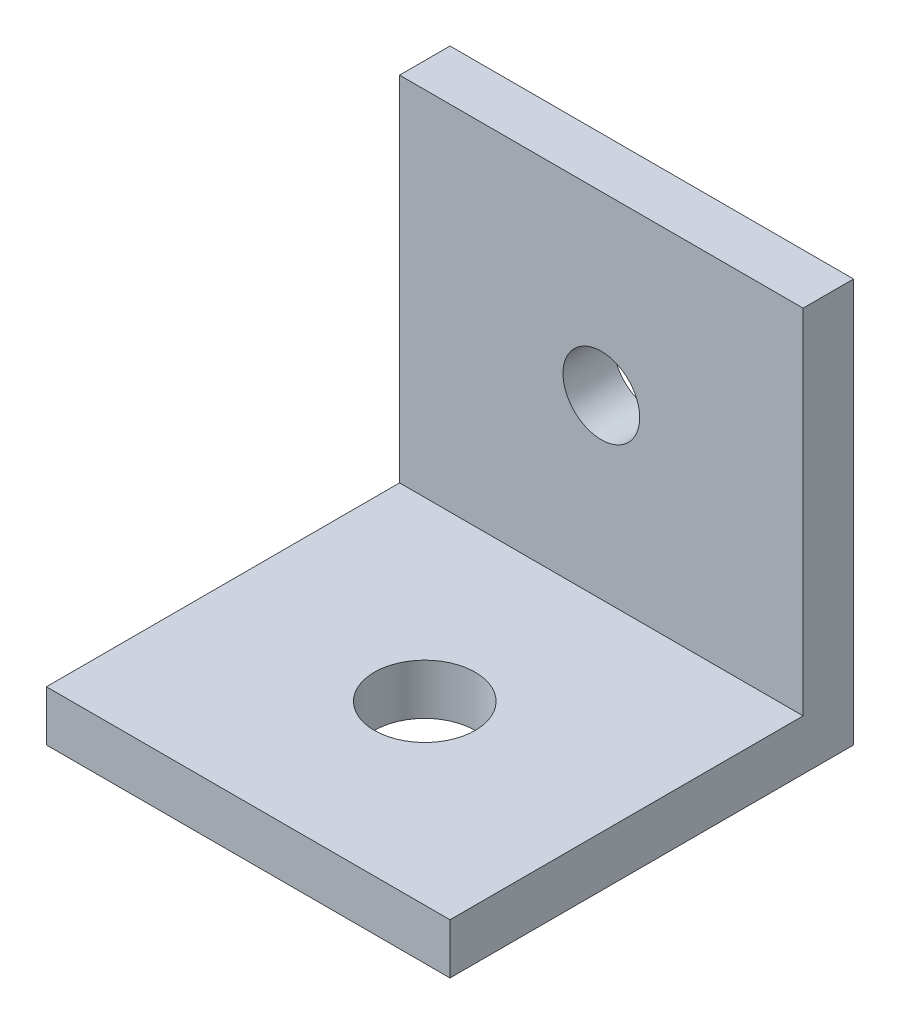
ISO-10303-21;
HEADER;
FILE_DESCRIPTION(('STEP AP214'),'2;1');
FILE_NAME('part.step','',(''),(''),'','','');
FILE_SCHEMA(('AUTOMOTIVE_DESIGN { 1 0 10303 214 1 1 1 1 }'));
ENDSEC;
DATA;
#1=APPLICATION_CONTEXT('core data for automotive mechanical design processes');
#2=APPLICATION_PROTOCOL_DEFINITION('international standard','automotive_design',2000,#1);
#3=PRODUCT_CONTEXT('',#1,'mechanical');
#4=PRODUCT('Part','Part','',(#3));
#5=PRODUCT_RELATED_PRODUCT_CATEGORY('part','',(#4));
#6=PRODUCT_DEFINITION_FORMATION('','',#4);
#7=PRODUCT_DEFINITION_CONTEXT('part definition',#1,'design');
#8=PRODUCT_DEFINITION('design','',#6,#7);
#9=PRODUCT_DEFINITION_SHAPE('','',#8);
#10=(LENGTH_UNIT() NAMED_UNIT(*) SI_UNIT(.MILLI.,.METRE.));
#11=(NAMED_UNIT(*) PLANE_ANGLE_UNIT() SI_UNIT($,.RADIAN.));
#12=(NAMED_UNIT(*) SI_UNIT($,.STERADIAN.) SOLID_ANGLE_UNIT());
#13=UNCERTAINTY_MEASURE_WITH_UNIT(LENGTH_MEASURE(1.E-05),#10,'distance_accuracy_value','');
#14=(GEOMETRIC_REPRESENTATION_CONTEXT(3) GLOBAL_UNCERTAINTY_ASSIGNED_CONTEXT((#13)) GLOBAL_UNIT_ASSIGNED_CONTEXT((#10,
#11,#12)) REPRESENTATION_CONTEXT('',''));
#15=CARTESIAN_POINT('',(0.,0.,0.));
#16=DIRECTION('',(0.,0.,1.));
#17=DIRECTION('',(1.,0.,0.));
#18=AXIS2_PLACEMENT_3D('',#15,#16,#17);
#19=CARTESIAN_POINT('',(0.,3.175,0.));
#20=DIRECTION('',(0.,-1.,0.));
#21=DIRECTION('',(0.,0.,-1.));
#22=AXIS2_PLACEMENT_3D('',#19,#20,#21);
#23=PLANE('',#22);
#24=CARTESIAN_POINT('',(0.,3.175,1.5875));
#25=DIRECTION('',(0.,1.,0.));
#26=DIRECTION('',(0.,0.,1.));
#27=AXIS2_PLACEMENT_3D('',#24,#25,#26);
#28=CIRCLE('',#27,3.175);
#29=CARTESIAN_POINT('',(0.,3.175,4.7625));
#30=VERTEX_POINT('',#29);
#31=EDGE_CURVE('E156',#30,#30,#28,.T.);
#32=ORIENTED_EDGE('',*,*,#31,.F.);
#33=EDGE_LOOP('',(#32));
#34=FACE_BOUND('',#33,.T.);
#35=DIRECTION('',(1.,0.,0.));
#36=VECTOR('',#35,1.);
#37=CARTESIAN_POINT('',(-12.7,3.175,-9.525));
#38=LINE('',#37,#36);
#39=CARTESIAN_POINT('',(-12.7,3.175,-9.525));
#40=VERTEX_POINT('',#39);
#41=CARTESIAN_POINT('',(12.7,3.175,-9.525));
#42=VERTEX_POINT('',#41);
#43=EDGE_CURVE('E54',#40,#42,#38,.T.);
#44=ORIENTED_EDGE('',*,*,#43,.F.);
#45=DIRECTION('',(0.,0.,1.));
#46=VECTOR('',#45,1.);
#47=CARTESIAN_POINT('',(-12.7,3.175,12.7));
#48=LINE('',#47,#46);
#49=CARTESIAN_POINT('',(-12.7,3.175,12.7));
#50=VERTEX_POINT('',#49);
#51=EDGE_CURVE('E140',#40,#50,#48,.T.);
#52=ORIENTED_EDGE('',*,*,#51,.T.);
#53=DIRECTION('',(1.,0.,0.));
#54=VECTOR('',#53,1.);
#55=CARTESIAN_POINT('',(-12.7,3.175,12.7));
#56=LINE('',#55,#54);
#57=CARTESIAN_POINT('',(12.7,3.175,12.7));
#58=VERTEX_POINT('',#57);
#59=EDGE_CURVE('E60',#50,#58,#56,.T.);
#60=ORIENTED_EDGE('',*,*,#59,.T.);
#61=DIRECTION('',(0.,0.,-1.));
#62=VECTOR('',#61,1.);
#63=CARTESIAN_POINT('',(12.7,3.175,12.7));
#64=LINE('',#63,#62);
#65=EDGE_CURVE('E89',#58,#42,#64,.T.);
#66=ORIENTED_EDGE('',*,*,#65,.T.);
#67=EDGE_LOOP('',(#44,#52,#60,#66));
#68=FACE_BOUND('',#67,.T.);
#69=ADVANCED_FACE('F39',(#34,#68),#23,.F.);
#70=CARTESIAN_POINT('',(12.7,3.175,12.7));
#71=DIRECTION('',(-1.,0.,0.));
#72=DIRECTION('',(0.,0.,1.));
#73=AXIS2_PLACEMENT_3D('',#70,#71,#72);
#74=PLANE('',#73);
#75=DIRECTION('',(0.,0.,-1.));
#76=VECTOR('',#75,1.);
#77=CARTESIAN_POINT('',(12.7,0.,12.7));
#78=LINE('',#77,#76);
#79=CARTESIAN_POINT('',(12.7,0.,12.7));
#80=VERTEX_POINT('',#79);
#81=CARTESIAN_POINT('',(12.7,0.,-12.7));
#82=VERTEX_POINT('',#81);
#83=EDGE_CURVE('E95',#80,#82,#78,.T.);
#84=ORIENTED_EDGE('',*,*,#83,.T.);
#85=DIRECTION('',(0.,-1.,0.));
#86=VECTOR('',#85,1.);
#87=CARTESIAN_POINT('',(12.7,3.175,-12.7));
#88=LINE('',#87,#86);
#89=CARTESIAN_POINT('',(12.7,25.4,-12.7));
#90=VERTEX_POINT('',#89);
#91=EDGE_CURVE('E11',#90,#82,#88,.T.);
#92=ORIENTED_EDGE('',*,*,#91,.F.);
#93=DIRECTION('',(0.,0.,-1.));
#94=VECTOR('',#93,1.);
#95=CARTESIAN_POINT('',(12.7,25.4,-12.7));
#96=LINE('',#95,#94);
#97=CARTESIAN_POINT('',(12.7,25.4,-9.525));
#98=VERTEX_POINT('',#97);
#99=EDGE_CURVE('E131',#98,#90,#96,.T.);
#100=ORIENTED_EDGE('',*,*,#99,.F.);
#101=DIRECTION('',(0.,-1.,0.));
#102=VECTOR('',#101,1.);
#103=CARTESIAN_POINT('',(12.7,25.4,-9.525));
#104=LINE('',#103,#102);
#105=EDGE_CURVE('E104',#98,#42,#104,.T.);
#106=ORIENTED_EDGE('',*,*,#105,.T.);
#107=ORIENTED_EDGE('',*,*,#65,.F.);
#108=DIRECTION('',(0.,-1.,0.));
#109=VECTOR('',#108,1.);
#110=CARTESIAN_POINT('',(12.7,3.175,12.7));
#111=LINE('',#110,#109);
#112=EDGE_CURVE('E82',#58,#80,#111,.T.);
#113=ORIENTED_EDGE('',*,*,#112,.T.);
#114=EDGE_LOOP('',(#84,#92,#100,#106,#107,#113));
#115=FACE_BOUND('',#114,.T.);
#116=ADVANCED_FACE('F41',(#115),#74,.F.);
#117=CARTESIAN_POINT('',(-12.7,3.175,-12.7));
#118=DIRECTION('',(0.,0.,1.));
#119=DIRECTION('',(1.,0.,0.));
#120=AXIS2_PLACEMENT_3D('',#117,#118,#119);
#121=PLANE('',#120);
#122=CARTESIAN_POINT('',(0.,14.2875,-12.7));
#123=DIRECTION('',(0.,0.,1.));
#124=DIRECTION('',(1.,0.,0.));
#125=AXIS2_PLACEMENT_3D('',#122,#123,#124);
#126=CIRCLE('',#125,2.413);
#127=CARTESIAN_POINT('',(2.41299999999999,14.2875,-12.7));
#128=VERTEX_POINT('',#127);
#129=EDGE_CURVE('E138',#128,#128,#126,.T.);
#130=ORIENTED_EDGE('',*,*,#129,.T.);
#131=EDGE_LOOP('',(#130));
#132=FACE_BOUND('',#131,.T.);
#133=DIRECTION('',(-1.,0.,0.));
#134=VECTOR('',#133,1.);
#135=CARTESIAN_POINT('',(-12.7,0.,-12.7));
#136=LINE('',#135,#134);
#137=CARTESIAN_POINT('',(-12.7,0.,-12.7));
#138=VERTEX_POINT('',#137);
#139=EDGE_CURVE('E99',#82,#138,#136,.T.);
#140=ORIENTED_EDGE('',*,*,#139,.T.);
#141=DIRECTION('',(0.,-1.,0.));
#142=VECTOR('',#141,1.);
#143=CARTESIAN_POINT('',(-12.7,3.175,-12.7));
#144=LINE('',#143,#142);
#145=CARTESIAN_POINT('',(-12.7,25.4,-12.7));
#146=VERTEX_POINT('',#145);
#147=EDGE_CURVE('E47',#146,#138,#144,.T.);
#148=ORIENTED_EDGE('',*,*,#147,.F.);
#149=DIRECTION('',(-1.,0.,0.));
#150=VECTOR('',#149,1.);
#151=CARTESIAN_POINT('',(-12.7,25.4,-12.7));
#152=LINE('',#151,#150);
#153=EDGE_CURVE('E123',#90,#146,#152,.T.);
#154=ORIENTED_EDGE('',*,*,#153,.F.);
#155=ORIENTED_EDGE('',*,*,#91,.T.);
#156=EDGE_LOOP('',(#140,#148,#154,#155));
#157=FACE_BOUND('',#156,.T.);
#158=ADVANCED_FACE('F121',(#132,#157),#121,.F.);
#159=CARTESIAN_POINT('',(-12.7,3.175,12.7));
#160=DIRECTION('',(1.,0.,0.));
#161=DIRECTION('',(0.,0.,-1.));
#162=AXIS2_PLACEMENT_3D('',#159,#160,#161);
#163=PLANE('',#162);
#164=DIRECTION('',(0.,0.,1.));
#165=VECTOR('',#164,1.);
#166=CARTESIAN_POINT('',(-12.7,0.,12.7));
#167=LINE('',#166,#165);
#168=CARTESIAN_POINT('',(-12.7,0.,12.7));
#169=VERTEX_POINT('',#168);
#170=EDGE_CURVE('E90',#138,#169,#167,.T.);
#171=ORIENTED_EDGE('',*,*,#170,.T.);
#172=DIRECTION('',(0.,-1.,0.));
#173=VECTOR('',#172,1.);
#174=CARTESIAN_POINT('',(-12.7,3.175,12.7));
#175=LINE('',#174,#173);
#176=EDGE_CURVE('E85',#50,#169,#175,.T.);
#177=ORIENTED_EDGE('',*,*,#176,.F.);
#178=ORIENTED_EDGE('',*,*,#51,.F.);
#179=DIRECTION('',(0.,-1.,0.));
#180=VECTOR('',#179,1.);
#181=CARTESIAN_POINT('',(-12.7,25.4,-9.525));
#182=LINE('',#181,#180);
#183=CARTESIAN_POINT('',(-12.7,25.4,-9.525));
#184=VERTEX_POINT('',#183);
#185=EDGE_CURVE('E100',#184,#40,#182,.T.);
#186=ORIENTED_EDGE('',*,*,#185,.F.);
#187=DIRECTION('',(0.,0.,1.));
#188=VECTOR('',#187,1.);
#189=CARTESIAN_POINT('',(-12.7,25.4,-12.7));
#190=LINE('',#189,#188);
#191=EDGE_CURVE('E117',#146,#184,#190,.T.);
#192=ORIENTED_EDGE('',*,*,#191,.F.);
#193=ORIENTED_EDGE('',*,*,#147,.T.);
#194=EDGE_LOOP('',(#171,#177,#178,#186,#192,#193));
#195=FACE_BOUND('',#194,.T.);
#196=ADVANCED_FACE('F114',(#195),#163,.F.);
#197=CARTESIAN_POINT('',(-12.7,3.175,12.7));
#198=DIRECTION('',(0.,0.,-1.));
#199=DIRECTION('',(-1.,0.,0.));
#200=AXIS2_PLACEMENT_3D('',#197,#198,#199);
#201=PLANE('',#200);
#202=DIRECTION('',(1.,0.,0.));
#203=VECTOR('',#202,1.);
#204=CARTESIAN_POINT('',(-12.7,0.,12.7));
#205=LINE('',#204,#203);
#206=EDGE_CURVE('E79',#169,#80,#205,.T.);
#207=ORIENTED_EDGE('',*,*,#206,.T.);
#208=ORIENTED_EDGE('',*,*,#112,.F.);
#209=ORIENTED_EDGE('',*,*,#59,.F.);
#210=ORIENTED_EDGE('',*,*,#176,.T.);
#211=EDGE_LOOP('',(#207,#208,#209,#210));
#212=FACE_BOUND('',#211,.T.);
#213=ADVANCED_FACE('F81',(#212),#201,.F.);
#214=CARTESIAN_POINT('',(0.,0.,0.));
#215=DIRECTION('',(0.,-1.,0.));
#216=DIRECTION('',(0.,0.,-1.));
#217=AXIS2_PLACEMENT_3D('',#214,#215,#216);
#218=PLANE('',#217);
#219=CARTESIAN_POINT('',(0.,0.,1.5875));
#220=DIRECTION('',(0.,1.,0.));
#221=DIRECTION('',(0.,0.,1.));
#222=AXIS2_PLACEMENT_3D('',#219,#220,#221);
#223=CIRCLE('',#222,3.175);
#224=CARTESIAN_POINT('',(0.,0.,4.7625));
#225=VERTEX_POINT('',#224);
#226=EDGE_CURVE('E153',#225,#225,#223,.T.);
#227=ORIENTED_EDGE('',*,*,#226,.T.);
#228=EDGE_LOOP('',(#227));
#229=FACE_BOUND('',#228,.T.);
#230=ORIENTED_EDGE('',*,*,#83,.F.);
#231=ORIENTED_EDGE('',*,*,#206,.F.);
#232=ORIENTED_EDGE('',*,*,#170,.F.);
#233=ORIENTED_EDGE('',*,*,#139,.F.);
#234=EDGE_LOOP('',(#230,#231,#232,#233));
#235=FACE_BOUND('',#234,.T.);
#236=ADVANCED_FACE('F98',(#229,#235),#218,.T.);
#237=CARTESIAN_POINT('',(-12.7,25.4,-9.525));
#238=DIRECTION('',(0.,0.,-1.));
#239=DIRECTION('',(-1.,0.,0.));
#240=AXIS2_PLACEMENT_3D('',#237,#238,#239);
#241=PLANE('',#240);
#242=CARTESIAN_POINT('',(0.,14.2875,-9.525));
#243=DIRECTION('',(0.,0.,1.));
#244=DIRECTION('',(1.,0.,0.));
#245=AXIS2_PLACEMENT_3D('',#242,#243,#244);
#246=CIRCLE('',#245,2.413);
#247=CARTESIAN_POINT('',(2.41299999999999,14.2875,-9.525));
#248=VERTEX_POINT('',#247);
#249=EDGE_CURVE('E150',#248,#248,#246,.T.);
#250=ORIENTED_EDGE('',*,*,#249,.F.);
#251=EDGE_LOOP('',(#250));
#252=FACE_BOUND('',#251,.T.);
#253=ORIENTED_EDGE('',*,*,#43,.T.);
#254=ORIENTED_EDGE('',*,*,#105,.F.);
#255=DIRECTION('',(1.,0.,0.));
#256=VECTOR('',#255,1.);
#257=CARTESIAN_POINT('',(-12.7,25.4,-9.525));
#258=LINE('',#257,#256);
#259=EDGE_CURVE('E134',#184,#98,#258,.T.);
#260=ORIENTED_EDGE('',*,*,#259,.F.);
#261=ORIENTED_EDGE('',*,*,#185,.T.);
#262=EDGE_LOOP('',(#253,#254,#260,#261));
#263=FACE_BOUND('',#262,.T.);
#264=ADVANCED_FACE('F143',(#252,#263),#241,.F.);
#265=CARTESIAN_POINT('',(0.,25.4,0.));
#266=DIRECTION('',(0.,1.,0.));
#267=DIRECTION('',(0.,0.,1.));
#268=AXIS2_PLACEMENT_3D('',#265,#266,#267);
#269=PLANE('',#268);
#270=ORIENTED_EDGE('',*,*,#191,.T.);
#271=ORIENTED_EDGE('',*,*,#259,.T.);
#272=ORIENTED_EDGE('',*,*,#99,.T.);
#273=ORIENTED_EDGE('',*,*,#153,.T.);
#274=EDGE_LOOP('',(#270,#271,#272,#273));
#275=FACE_BOUND('',#274,.T.);
#276=ADVANCED_FACE('F127',(#275),#269,.T.);
#277=CARTESIAN_POINT('',(0.,14.2875,-12.7));
#278=DIRECTION('',(0.,0.,1.));
#279=DIRECTION('',(1.,0.,0.));
#280=AXIS2_PLACEMENT_3D('',#277,#278,#279);
#281=CYLINDRICAL_SURFACE('',#280,2.413);
#282=ORIENTED_EDGE('',*,*,#129,.F.);
#283=EDGE_LOOP('',(#282));
#284=FACE_BOUND('',#283,.T.);
#285=ORIENTED_EDGE('',*,*,#249,.T.);
#286=EDGE_LOOP('',(#285));
#287=FACE_BOUND('',#286,.T.);
#288=ADVANCED_FACE('F166',(#284,#287),#281,.F.);
#289=CARTESIAN_POINT('',(0.,0.,1.5875));
#290=DIRECTION('',(0.,1.,0.));
#291=DIRECTION('',(0.,0.,1.));
#292=AXIS2_PLACEMENT_3D('',#289,#290,#291);
#293=CYLINDRICAL_SURFACE('',#292,3.175);
#294=ORIENTED_EDGE('',*,*,#226,.F.);
#295=EDGE_LOOP('',(#294));
#296=FACE_BOUND('',#295,.T.);
#297=ORIENTED_EDGE('',*,*,#31,.T.);
#298=EDGE_LOOP('',(#297));
#299=FACE_BOUND('',#298,.T.);
#300=ADVANCED_FACE('F163',(#296,#299),#293,.F.);
#301=CLOSED_SHELL('',(#69,#116,#158,#196,#213,#236,#264,#276,#288,#300));
#302=MANIFOLD_SOLID_BREP('B2',#301);
#303=ADVANCED_BREP_SHAPE_REPRESENTATION('',(#18,#302),#14);
#304=SHAPE_DEFINITION_REPRESENTATION(#9,#303);
ENDSEC;
END-ISO-10303-21;
